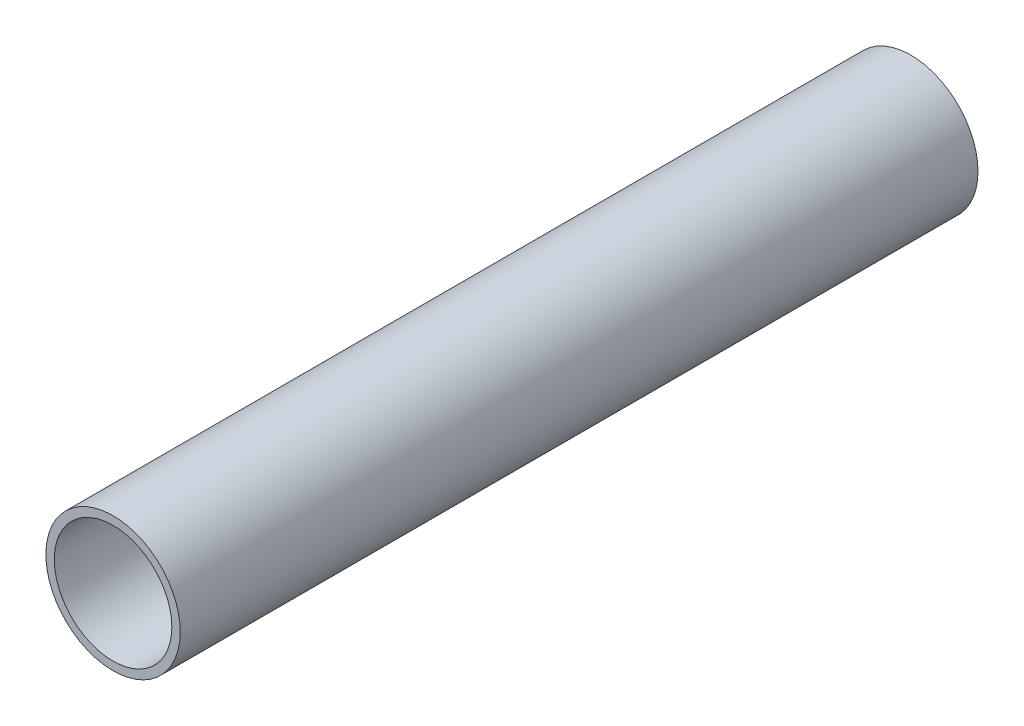
ISO-10303-21;
HEADER;
FILE_DESCRIPTION(('STEP AP214'),'2;1');
FILE_NAME('part.step','',(''),(''),'','','');
FILE_SCHEMA(('AUTOMOTIVE_DESIGN { 1 0 10303 214 1 1 1 1 }'));
ENDSEC;
DATA;
#1=APPLICATION_CONTEXT('core data for automotive mechanical design processes');
#2=APPLICATION_PROTOCOL_DEFINITION('international standard','automotive_design',2000,#1);
#3=PRODUCT_CONTEXT('',#1,'mechanical');
#4=PRODUCT('Part','Part','',(#3));
#5=PRODUCT_RELATED_PRODUCT_CATEGORY('part','',(#4));
#6=PRODUCT_DEFINITION_FORMATION('','',#4);
#7=PRODUCT_DEFINITION_CONTEXT('part definition',#1,'design');
#8=PRODUCT_DEFINITION('design','',#6,#7);
#9=PRODUCT_DEFINITION_SHAPE('','',#8);
#10=(LENGTH_UNIT() NAMED_UNIT(*) SI_UNIT(.MILLI.,.METRE.));
#11=(NAMED_UNIT(*) PLANE_ANGLE_UNIT() SI_UNIT($,.RADIAN.));
#12=(NAMED_UNIT(*) SI_UNIT($,.STERADIAN.) SOLID_ANGLE_UNIT());
#13=UNCERTAINTY_MEASURE_WITH_UNIT(LENGTH_MEASURE(1.E-05),#10,'distance_accuracy_value','');
#14=(GEOMETRIC_REPRESENTATION_CONTEXT(3) GLOBAL_UNCERTAINTY_ASSIGNED_CONTEXT((#13)) GLOBAL_UNIT_ASSIGNED_CONTEXT((#10,
#11,#12)) REPRESENTATION_CONTEXT('',''));
#15=CARTESIAN_POINT('',(0.,0.,0.));
#16=DIRECTION('',(0.,0.,1.));
#17=DIRECTION('',(1.,0.,0.));
#18=AXIS2_PLACEMENT_3D('',#15,#16,#17);
#19=CARTESIAN_POINT('',(0.,0.,95.));
#20=DIRECTION('',(0.,0.,1.));
#21=DIRECTION('',(1.,0.,0.));
#22=AXIS2_PLACEMENT_3D('',#19,#20,#21);
#23=PLANE('',#22);
#24=CARTESIAN_POINT('',(0.,0.,95.));
#25=DIRECTION('',(0.,0.,1.));
#26=DIRECTION('',(1.,0.,0.));
#27=AXIS2_PLACEMENT_3D('',#24,#25,#26);
#28=CIRCLE('',#27,8.);
#29=CARTESIAN_POINT('',(8.,0.,95.));
#30=VERTEX_POINT('',#29);
#31=EDGE_CURVE('E10',#30,#30,#28,.T.);
#32=ORIENTED_EDGE('',*,*,#31,.T.);
#33=EDGE_LOOP('',(#32));
#34=FACE_BOUND('',#33,.T.);
#35=CARTESIAN_POINT('',(0.,0.,95.));
#36=DIRECTION('',(0.,0.,1.));
#37=DIRECTION('',(1.,0.,0.));
#38=AXIS2_PLACEMENT_3D('',#35,#36,#37);
#39=CIRCLE('',#38,7.);
#40=CARTESIAN_POINT('',(7.,0.,95.));
#41=VERTEX_POINT('',#40);
#42=EDGE_CURVE('E50',#41,#41,#39,.T.);
#43=ORIENTED_EDGE('',*,*,#42,.F.);
#44=EDGE_LOOP('',(#43));
#45=FACE_BOUND('',#44,.T.);
#46=ADVANCED_FACE('F36',(#34,#45),#23,.T.);
#47=CARTESIAN_POINT('',(0.,0.,0.));
#48=DIRECTION('',(0.,0.,1.));
#49=DIRECTION('',(1.,0.,0.));
#50=AXIS2_PLACEMENT_3D('',#47,#48,#49);
#51=PLANE('',#50);
#52=CARTESIAN_POINT('',(0.,0.,0.));
#53=DIRECTION('',(0.,0.,1.));
#54=DIRECTION('',(1.,0.,0.));
#55=AXIS2_PLACEMENT_3D('',#52,#53,#54);
#56=CIRCLE('',#55,8.);
#57=CARTESIAN_POINT('',(8.,0.,0.));
#58=VERTEX_POINT('',#57);
#59=EDGE_CURVE('E40',#58,#58,#56,.T.);
#60=ORIENTED_EDGE('',*,*,#59,.F.);
#61=EDGE_LOOP('',(#60));
#62=FACE_BOUND('',#61,.T.);
#63=CARTESIAN_POINT('',(0.,0.,0.));
#64=DIRECTION('',(0.,0.,1.));
#65=DIRECTION('',(1.,0.,0.));
#66=AXIS2_PLACEMENT_3D('',#63,#64,#65);
#67=CIRCLE('',#66,7.);
#68=CARTESIAN_POINT('',(7.,0.,0.));
#69=VERTEX_POINT('',#68);
#70=EDGE_CURVE('E52',#69,#69,#67,.T.);
#71=ORIENTED_EDGE('',*,*,#70,.T.);
#72=EDGE_LOOP('',(#71));
#73=FACE_BOUND('',#72,.T.);
#74=ADVANCED_FACE('F65',(#62,#73),#51,.F.);
#75=CARTESIAN_POINT('',(0.,0.,95.));
#76=DIRECTION('',(0.,0.,-1.));
#77=DIRECTION('',(-1.,0.,0.));
#78=AXIS2_PLACEMENT_3D('',#75,#76,#77);
#79=CYLINDRICAL_SURFACE('',#78,8.);
#80=ORIENTED_EDGE('',*,*,#31,.F.);
#81=EDGE_LOOP('',(#80));
#82=FACE_BOUND('',#81,.T.);
#83=ORIENTED_EDGE('',*,*,#59,.T.);
#84=EDGE_LOOP('',(#83));
#85=FACE_BOUND('',#84,.T.);
#86=ADVANCED_FACE('F38',(#82,#85),#79,.T.);
#87=CARTESIAN_POINT('',(0.,0.,95.));
#88=DIRECTION('',(0.,0.,-1.));
#89=DIRECTION('',(-1.,0.,0.));
#90=AXIS2_PLACEMENT_3D('',#87,#88,#89);
#91=CYLINDRICAL_SURFACE('',#90,7.);
#92=ORIENTED_EDGE('',*,*,#42,.T.);
#93=EDGE_LOOP('',(#92));
#94=FACE_BOUND('',#93,.T.);
#95=ORIENTED_EDGE('',*,*,#70,.F.);
#96=EDGE_LOOP('',(#95));
#97=FACE_BOUND('',#96,.T.);
#98=ADVANCED_FACE('F61',(#94,#97),#91,.F.);
#99=CLOSED_SHELL('',(#46,#74,#86,#98));
#100=MANIFOLD_SOLID_BREP('B2',#99);
#101=ADVANCED_BREP_SHAPE_REPRESENTATION('',(#18,#100),#14);
#102=SHAPE_DEFINITION_REPRESENTATION(#9,#101);
ENDSEC;
END-ISO-10303-21;
